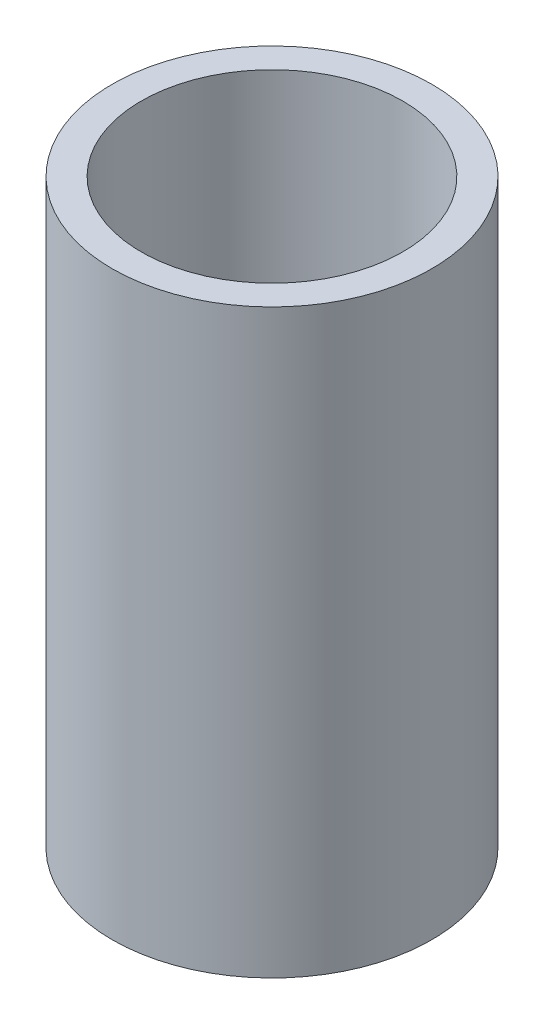
ISO-10303-21;
HEADER;
FILE_DESCRIPTION(('STEP AP214'),'2;1');
FILE_NAME('part.step','',(''),(''),'','','');
FILE_SCHEMA(('AUTOMOTIVE_DESIGN { 1 0 10303 214 1 1 1 1 }'));
ENDSEC;
DATA;
#1=APPLICATION_CONTEXT('core data for automotive mechanical design processes');
#2=APPLICATION_PROTOCOL_DEFINITION('international standard','automotive_design',2000,#1);
#3=PRODUCT_CONTEXT('',#1,'mechanical');
#4=PRODUCT('Part','Part','',(#3));
#5=PRODUCT_RELATED_PRODUCT_CATEGORY('part','',(#4));
#6=PRODUCT_DEFINITION_FORMATION('','',#4);
#7=PRODUCT_DEFINITION_CONTEXT('part definition',#1,'design');
#8=PRODUCT_DEFINITION('design','',#6,#7);
#9=PRODUCT_DEFINITION_SHAPE('','',#8);
#10=(LENGTH_UNIT() NAMED_UNIT(*) SI_UNIT(.MILLI.,.METRE.));
#11=(NAMED_UNIT(*) PLANE_ANGLE_UNIT() SI_UNIT($,.RADIAN.));
#12=(NAMED_UNIT(*) SI_UNIT($,.STERADIAN.) SOLID_ANGLE_UNIT());
#13=UNCERTAINTY_MEASURE_WITH_UNIT(LENGTH_MEASURE(1.E-05),#10,'distance_accuracy_value','');
#14=(GEOMETRIC_REPRESENTATION_CONTEXT(3) GLOBAL_UNCERTAINTY_ASSIGNED_CONTEXT((#13)) GLOBAL_UNIT_ASSIGNED_CONTEXT((#10,
#11,#12)) REPRESENTATION_CONTEXT('',''));
#15=CARTESIAN_POINT('',(0.,0.,0.));
#16=DIRECTION('',(0.,0.,1.));
#17=DIRECTION('',(1.,0.,0.));
#18=AXIS2_PLACEMENT_3D('',#15,#16,#17);
#19=CARTESIAN_POINT('',(0.,-110.603092707212,0.));
#20=DIRECTION('',(0.,-1.,0.));
#21=DIRECTION('',(0.,0.,-1.));
#22=AXIS2_PLACEMENT_3D('',#19,#20,#21);
#23=CYLINDRICAL_SURFACE('',#22,44.9999999999999);
#24=CARTESIAN_POINT('',(0.,-100.,0.));
#25=DIRECTION('',(0.,-1.,0.));
#26=DIRECTION('',(0.,0.,-1.));
#27=AXIS2_PLACEMENT_3D('',#24,#25,#26);
#28=CIRCLE('',#27,44.9999999999999);
#29=CARTESIAN_POINT('',(0.,-100.,-44.9999999999999));
#30=VERTEX_POINT('',#29);
#31=EDGE_CURVE('E10',#30,#30,#28,.T.);
#32=ORIENTED_EDGE('',*,*,#31,.T.);
#33=EDGE_LOOP('',(#32));
#34=FACE_BOUND('',#33,.T.);
#35=CARTESIAN_POINT('',(0.,100.,0.));
#36=DIRECTION('',(0.,-1.,0.));
#37=DIRECTION('',(0.,0.,-1.));
#38=AXIS2_PLACEMENT_3D('',#35,#36,#37);
#39=CIRCLE('',#38,44.9999999999999);
#40=CARTESIAN_POINT('',(0.,100.,-44.9999999999999));
#41=VERTEX_POINT('',#40);
#42=EDGE_CURVE('E46',#41,#41,#39,.T.);
#43=ORIENTED_EDGE('',*,*,#42,.F.);
#44=EDGE_LOOP('',(#43));
#45=FACE_BOUND('',#44,.T.);
#46=ADVANCED_FACE('F32',(#34,#45),#23,.F.);
#47=CARTESIAN_POINT('',(44.9999999999999,-100.,0.));
#48=DIRECTION('',(0.,-1.,0.));
#49=DIRECTION('',(0.,0.,-1.));
#50=AXIS2_PLACEMENT_3D('',#47,#48,#49);
#51=PLANE('',#50);
#52=CARTESIAN_POINT('',(0.,-100.,0.));
#53=DIRECTION('',(0.,-1.,0.));
#54=DIRECTION('',(0.,0.,-1.));
#55=AXIS2_PLACEMENT_3D('',#52,#53,#54);
#56=CIRCLE('',#55,54.9999999999999);
#57=CARTESIAN_POINT('',(0.,-100.,-54.9999999999999));
#58=VERTEX_POINT('',#57);
#59=EDGE_CURVE('E38',#58,#58,#56,.T.);
#60=ORIENTED_EDGE('',*,*,#59,.T.);
#61=EDGE_LOOP('',(#60));
#62=FACE_BOUND('',#61,.T.);
#63=ORIENTED_EDGE('',*,*,#31,.F.);
#64=EDGE_LOOP('',(#63));
#65=FACE_BOUND('',#64,.T.);
#66=ADVANCED_FACE('F56',(#62,#65),#51,.T.);
#67=CARTESIAN_POINT('',(0.,-110.603092707212,0.));
#68=DIRECTION('',(0.,-1.,0.));
#69=DIRECTION('',(0.,0.,-1.));
#70=AXIS2_PLACEMENT_3D('',#67,#68,#69);
#71=CYLINDRICAL_SURFACE('',#70,54.9999999999999);
#72=CARTESIAN_POINT('',(0.,100.,0.));
#73=DIRECTION('',(0.,-1.,0.));
#74=DIRECTION('',(0.,0.,-1.));
#75=AXIS2_PLACEMENT_3D('',#72,#73,#74);
#76=CIRCLE('',#75,54.9999999999999);
#77=CARTESIAN_POINT('',(0.,100.,-54.9999999999999));
#78=VERTEX_POINT('',#77);
#79=EDGE_CURVE('E42',#78,#78,#76,.T.);
#80=ORIENTED_EDGE('',*,*,#79,.T.);
#81=EDGE_LOOP('',(#80));
#82=FACE_BOUND('',#81,.T.);
#83=ORIENTED_EDGE('',*,*,#59,.F.);
#84=EDGE_LOOP('',(#83));
#85=FACE_BOUND('',#84,.T.);
#86=ADVANCED_FACE('F60',(#82,#85),#71,.T.);
#87=CARTESIAN_POINT('',(44.9999999999999,100.,0.));
#88=DIRECTION('',(0.,1.,0.));
#89=DIRECTION('',(0.,0.,1.));
#90=AXIS2_PLACEMENT_3D('',#87,#88,#89);
#91=PLANE('',#90);
#92=ORIENTED_EDGE('',*,*,#42,.T.);
#93=EDGE_LOOP('',(#92));
#94=FACE_BOUND('',#93,.T.);
#95=ORIENTED_EDGE('',*,*,#79,.F.);
#96=EDGE_LOOP('',(#95));
#97=FACE_BOUND('',#96,.T.);
#98=ADVANCED_FACE('F52',(#94,#97),#91,.T.);
#99=CLOSED_SHELL('',(#46,#66,#86,#98));
#100=MANIFOLD_SOLID_BREP('B2',#99);
#101=ADVANCED_BREP_SHAPE_REPRESENTATION('',(#18,#100),#14);
#102=SHAPE_DEFINITION_REPRESENTATION(#9,#101);
ENDSEC;
END-ISO-10303-21;
